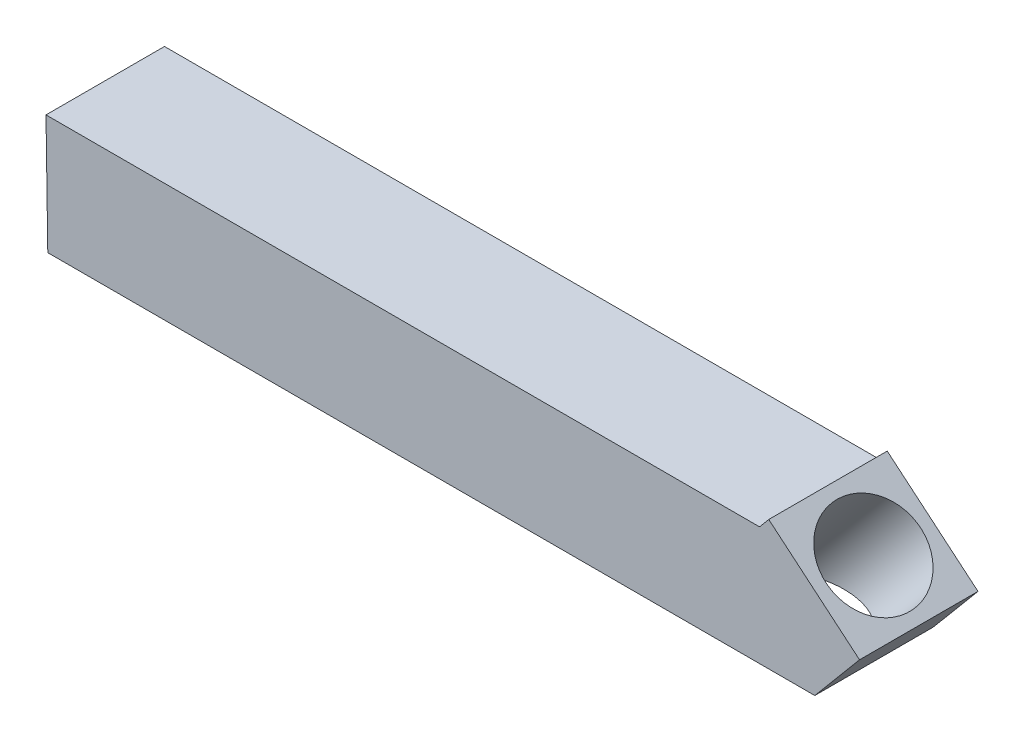
ISO-10303-21;
HEADER;
FILE_DESCRIPTION(('STEP AP214'),'2;1');
FILE_NAME('part.step','',(''),(''),'','','');
FILE_SCHEMA(('AUTOMOTIVE_DESIGN { 1 0 10303 214 1 1 1 1 }'));
ENDSEC;
DATA;
#1=APPLICATION_CONTEXT('core data for automotive mechanical design processes');
#2=APPLICATION_PROTOCOL_DEFINITION('international standard','automotive_design',2000,#1);
#3=PRODUCT_CONTEXT('',#1,'mechanical');
#4=PRODUCT('Part','Part','',(#3));
#5=PRODUCT_RELATED_PRODUCT_CATEGORY('part','',(#4));
#6=PRODUCT_DEFINITION_FORMATION('','',#4);
#7=PRODUCT_DEFINITION_CONTEXT('part definition',#1,'design');
#8=PRODUCT_DEFINITION('design','',#6,#7);
#9=PRODUCT_DEFINITION_SHAPE('','',#8);
#10=(LENGTH_UNIT() NAMED_UNIT(*) SI_UNIT(.MILLI.,.METRE.));
#11=(NAMED_UNIT(*) PLANE_ANGLE_UNIT() SI_UNIT($,.RADIAN.));
#12=(NAMED_UNIT(*) SI_UNIT($,.STERADIAN.) SOLID_ANGLE_UNIT());
#13=UNCERTAINTY_MEASURE_WITH_UNIT(LENGTH_MEASURE(1.E-05),#10,'distance_accuracy_value','');
#14=(GEOMETRIC_REPRESENTATION_CONTEXT(3) GLOBAL_UNCERTAINTY_ASSIGNED_CONTEXT((#13)) GLOBAL_UNIT_ASSIGNED_CONTEXT((#10,
#11,#12)) REPRESENTATION_CONTEXT('',''));
#15=CARTESIAN_POINT('',(0.,0.,0.));
#16=DIRECTION('',(0.,0.,1.));
#17=DIRECTION('',(1.,0.,0.));
#18=AXIS2_PLACEMENT_3D('',#15,#16,#17);
#19=CARTESIAN_POINT('',(-70.4061726678737,-77.7100601328562,2.5));
#20=DIRECTION('',(0.999885535757896,0.0151299498394764,0.));
#21=DIRECTION('',(-0.0151299498394764,0.999885535757896,0.));
#22=AXIS2_PLACEMENT_3D('',#19,#20,#21);
#23=PLANE('',#22);
#24=DIRECTION('',(0.0151299498394764,-0.999885535757896,0.));
#25=VECTOR('',#24,1.);
#26=CARTESIAN_POINT('',(-70.4061726678737,-77.7100601328562,0.));
#27=LINE('',#26,#25);
#28=CARTESIAN_POINT('',(-70.4061726678737,-77.7100601328562,0.));
#29=VERTEX_POINT('',#28);
#30=CARTESIAN_POINT('',(-70.368347793275,-80.209773972251,0.));
#31=VERTEX_POINT('',#30);
#32=EDGE_CURVE('E117',#29,#31,#27,.T.);
#33=ORIENTED_EDGE('',*,*,#32,.T.);
#34=DIRECTION('',(0.,0.,-1.));
#35=VECTOR('',#34,1.);
#36=CARTESIAN_POINT('',(-70.368347793275,-80.209773972251,2.5));
#37=LINE('',#36,#35);
#38=CARTESIAN_POINT('',(-70.368347793275,-80.209773972251,2.5));
#39=VERTEX_POINT('',#38);
#40=EDGE_CURVE('E11',#39,#31,#37,.T.);
#41=ORIENTED_EDGE('',*,*,#40,.F.);
#42=DIRECTION('',(0.0151299498394764,-0.999885535757896,0.));
#43=VECTOR('',#42,1.);
#44=CARTESIAN_POINT('',(-70.4061726678737,-77.7100601328562,2.5));
#45=LINE('',#44,#43);
#46=CARTESIAN_POINT('',(-70.4061726678737,-77.7100601328562,2.5));
#47=VERTEX_POINT('',#46);
#48=EDGE_CURVE('E128',#47,#39,#45,.T.);
#49=ORIENTED_EDGE('',*,*,#48,.F.);
#50=DIRECTION('',(0.,0.,-1.));
#51=VECTOR('',#50,1.);
#52=CARTESIAN_POINT('',(-70.4061726678737,-77.7100601328562,2.5));
#53=LINE('',#52,#51);
#54=EDGE_CURVE('E113',#47,#29,#53,.T.);
#55=ORIENTED_EDGE('',*,*,#54,.T.);
#56=EDGE_LOOP('',(#33,#41,#49,#55));
#57=FACE_BOUND('',#56,.T.);
#58=ADVANCED_FACE('F33',(#57),#23,.F.);
#59=CARTESIAN_POINT('',(-70.368347793275,-80.209773972251,2.5));
#60=DIRECTION('',(0.,1.,0.));
#61=DIRECTION('',(0.,0.,1.));
#62=AXIS2_PLACEMENT_3D('',#59,#60,#61);
#63=PLANE('',#62);
#64=CARTESIAN_POINT('',(-55.8162464207639,-80.209773972251,1.25));
#65=DIRECTION('',(0.,1.,0.));
#66=DIRECTION('',(1.,0.,0.));
#67=AXIS2_PLACEMENT_3D('',#64,#65,#66);
#68=ELLIPSE('',#67,1.3054072893277,0.999999999996499);
#69=CARTESIAN_POINT('',(-54.5108391314362,-80.209773972251,1.25));
#70=VERTEX_POINT('',#69);
#71=EDGE_CURVE('E121',#70,#70,#68,.T.);
#72=ORIENTED_EDGE('',*,*,#71,.T.);
#73=EDGE_LOOP('',(#72));
#74=FACE_BOUND('',#73,.T.);
#75=DIRECTION('',(1.,0.,0.));
#76=VECTOR('',#75,1.);
#77=CARTESIAN_POINT('',(-70.368347793275,-80.209773972251,0.));
#78=LINE('',#77,#76);
#79=CARTESIAN_POINT('',(-54.1844873090986,-80.209773972251,0.));
#80=VERTEX_POINT('',#79);
#81=EDGE_CURVE('E120',#31,#80,#78,.T.);
#82=ORIENTED_EDGE('',*,*,#81,.T.);
#83=DIRECTION('',(0.,0.,-1.));
#84=VECTOR('',#83,1.);
#85=CARTESIAN_POINT('',(-54.1844873090986,-80.209773972251,2.5));
#86=LINE('',#85,#84);
#87=CARTESIAN_POINT('',(-54.1844873090986,-80.209773972251,2.5));
#88=VERTEX_POINT('',#87);
#89=EDGE_CURVE('E41',#88,#80,#86,.T.);
#90=ORIENTED_EDGE('',*,*,#89,.F.);
#91=DIRECTION('',(1.,0.,0.));
#92=VECTOR('',#91,1.);
#93=CARTESIAN_POINT('',(-70.368347793275,-80.209773972251,2.5));
#94=LINE('',#93,#92);
#95=EDGE_CURVE('E86',#39,#88,#94,.T.);
#96=ORIENTED_EDGE('',*,*,#95,.F.);
#97=ORIENTED_EDGE('',*,*,#40,.T.);
#98=EDGE_LOOP('',(#82,#90,#96,#97));
#99=FACE_BOUND('',#98,.T.);
#100=ADVANCED_FACE('F152',(#74,#99),#63,.F.);
#101=CARTESIAN_POINT('',(-54.1844873090986,-80.209773972251,2.5));
#102=DIRECTION('',(-0.766044443118981,0.642787609686536,0.));
#103=DIRECTION('',(-0.642787609686536,-0.766044443118981,0.));
#104=AXIS2_PLACEMENT_3D('',#101,#102,#103);
#105=PLANE('',#104);
#106=DIRECTION('',(0.642787609686536,0.766044443118981,0.));
#107=VECTOR('',#106,1.);
#108=CARTESIAN_POINT('',(-54.1844873090986,-80.209773972251,0.));
#109=LINE('',#108,#107);
#110=CARTESIAN_POINT('',(-53.2406469454359,-79.0849488280205,0.));
#111=VERTEX_POINT('',#110);
#112=EDGE_CURVE('E123',#80,#111,#109,.T.);
#113=ORIENTED_EDGE('',*,*,#112,.T.);
#114=DIRECTION('',(0.,0.,-1.));
#115=VECTOR('',#114,1.);
#116=CARTESIAN_POINT('',(-53.2406469454359,-79.0849488280205,2.5));
#117=LINE('',#116,#115);
#118=CARTESIAN_POINT('',(-53.2406469454359,-79.0849488280205,2.5));
#119=VERTEX_POINT('',#118);
#120=EDGE_CURVE('E108',#119,#111,#117,.T.);
#121=ORIENTED_EDGE('',*,*,#120,.F.);
#122=DIRECTION('',(0.642787609686536,0.766044443118981,0.));
#123=VECTOR('',#122,1.);
#124=CARTESIAN_POINT('',(-54.1844873090986,-80.209773972251,2.5));
#125=LINE('',#124,#123);
#126=EDGE_CURVE('E99',#88,#119,#125,.T.);
#127=ORIENTED_EDGE('',*,*,#126,.F.);
#128=ORIENTED_EDGE('',*,*,#89,.T.);
#129=EDGE_LOOP('',(#113,#121,#127,#128));
#130=FACE_BOUND('',#129,.T.);
#131=ADVANCED_FACE('F134',(#130),#105,.F.);
#132=CARTESIAN_POINT('',(-53.2406469454359,-79.0849488280205,2.5));
#133=DIRECTION('',(-0.642787609686535,-0.766044443118982,0.));
#134=DIRECTION('',(0.766044443118982,-0.642787609686535,0.));
#135=AXIS2_PLACEMENT_3D('',#132,#133,#134);
#136=PLANE('',#135);
#137=CARTESIAN_POINT('',(-54.1982024993346,-78.2814643159123,1.25));
#138=DIRECTION('',(0.642787609686535,0.766044443118981,0.));
#139=DIRECTION('',(-0.766044443118981,0.642787609686535,0.));
#140=AXIS2_PLACEMENT_3D('',#137,#138,#139);
#141=CIRCLE('',#140,0.999999999996499);
#142=CARTESIAN_POINT('',(-54.9642469424509,-77.6386767062281,1.25));
#143=VERTEX_POINT('',#142);
#144=EDGE_CURVE('E170',#143,#143,#141,.T.);
#145=ORIENTED_EDGE('',*,*,#144,.F.);
#146=EDGE_LOOP('',(#145));
#147=FACE_BOUND('',#146,.T.);
#148=DIRECTION('',(-0.766044443118982,0.642787609686535,0.));
#149=VECTOR('',#148,1.);
#150=CARTESIAN_POINT('',(-53.2406469454359,-79.0849488280205,0.));
#151=LINE('',#150,#149);
#152=CARTESIAN_POINT('',(-55.1557580532333,-77.4779798038041,0.));
#153=VERTEX_POINT('',#152);
#154=EDGE_CURVE('E107',#111,#153,#151,.T.);
#155=ORIENTED_EDGE('',*,*,#154,.T.);
#156=DIRECTION('',(0.,0.,-1.));
#157=VECTOR('',#156,1.);
#158=CARTESIAN_POINT('',(-55.1557580532333,-77.4779798038041,2.5));
#159=LINE('',#158,#157);
#160=CARTESIAN_POINT('',(-55.1557580532333,-77.4779798038041,2.5));
#161=VERTEX_POINT('',#160);
#162=EDGE_CURVE('E104',#161,#153,#159,.T.);
#163=ORIENTED_EDGE('',*,*,#162,.F.);
#164=DIRECTION('',(-0.766044443118982,0.642787609686535,0.));
#165=VECTOR('',#164,1.);
#166=CARTESIAN_POINT('',(-53.2406469454359,-79.0849488280205,2.5));
#167=LINE('',#166,#165);
#168=EDGE_CURVE('E93',#119,#161,#167,.T.);
#169=ORIENTED_EDGE('',*,*,#168,.F.);
#170=ORIENTED_EDGE('',*,*,#120,.T.);
#171=EDGE_LOOP('',(#155,#163,#169,#170));
#172=FACE_BOUND('',#171,.T.);
#173=ADVANCED_FACE('F105',(#147,#172),#136,.F.);
#174=CARTESIAN_POINT('',(-55.3504965717444,-77.7100601328562,2.5));
#175=DIRECTION('',(0.766044443118984,-0.642787609686532,0.));
#176=DIRECTION('',(0.642787609686532,0.766044443118984,0.));
#177=AXIS2_PLACEMENT_3D('',#174,#175,#176);
#178=PLANE('',#177);
#179=DIRECTION('',(-0.642787609686532,-0.766044443118984,0.));
#180=VECTOR('',#179,1.);
#181=CARTESIAN_POINT('',(-55.3504965717444,-77.7100601328562,0.));
#182=LINE('',#181,#180);
#183=CARTESIAN_POINT('',(-55.3504965717444,-77.7100601328562,0.));
#184=VERTEX_POINT('',#183);
#185=EDGE_CURVE('E72',#153,#184,#182,.T.);
#186=ORIENTED_EDGE('',*,*,#185,.T.);
#187=DIRECTION('',(0.,0.,-1.));
#188=VECTOR('',#187,1.);
#189=CARTESIAN_POINT('',(-55.3504965717444,-77.7100601328562,2.5));
#190=LINE('',#189,#188);
#191=CARTESIAN_POINT('',(-55.3504965717444,-77.7100601328562,2.5));
#192=VERTEX_POINT('',#191);
#193=EDGE_CURVE('E109',#192,#184,#190,.T.);
#194=ORIENTED_EDGE('',*,*,#193,.F.);
#195=DIRECTION('',(-0.642787609686532,-0.766044443118984,0.));
#196=VECTOR('',#195,1.);
#197=CARTESIAN_POINT('',(-55.3504965717444,-77.7100601328562,2.5));
#198=LINE('',#197,#196);
#199=EDGE_CURVE('E97',#161,#192,#198,.T.);
#200=ORIENTED_EDGE('',*,*,#199,.F.);
#201=ORIENTED_EDGE('',*,*,#162,.T.);
#202=EDGE_LOOP('',(#186,#194,#200,#201));
#203=FACE_BOUND('',#202,.T.);
#204=ADVANCED_FACE('F111',(#203),#178,.F.);
#205=CARTESIAN_POINT('',(-70.4061726678737,-77.7100601328562,2.5));
#206=DIRECTION('',(0.,-1.,0.));
#207=DIRECTION('',(0.,0.,-1.));
#208=AXIS2_PLACEMENT_3D('',#205,#206,#207);
#209=PLANE('',#208);
#210=DIRECTION('',(-1.,0.,0.));
#211=VECTOR('',#210,1.);
#212=CARTESIAN_POINT('',(-70.4061726678737,-77.7100601328562,0.));
#213=LINE('',#212,#211);
#214=EDGE_CURVE('E78',#184,#29,#213,.T.);
#215=ORIENTED_EDGE('',*,*,#214,.T.);
#216=ORIENTED_EDGE('',*,*,#54,.F.);
#217=DIRECTION('',(-1.,0.,0.));
#218=VECTOR('',#217,1.);
#219=CARTESIAN_POINT('',(-70.4061726678737,-77.7100601328562,2.5));
#220=LINE('',#219,#218);
#221=EDGE_CURVE('E49',#192,#47,#220,.T.);
#222=ORIENTED_EDGE('',*,*,#221,.F.);
#223=ORIENTED_EDGE('',*,*,#193,.T.);
#224=EDGE_LOOP('',(#215,#216,#222,#223));
#225=FACE_BOUND('',#224,.T.);
#226=ADVANCED_FACE('F141',(#225),#209,.F.);
#227=CARTESIAN_POINT('',(0.,0.,2.5));
#228=DIRECTION('',(0.,0.,1.));
#229=DIRECTION('',(1.,0.,0.));
#230=AXIS2_PLACEMENT_3D('',#227,#228,#229);
#231=PLANE('',#230);
#232=ORIENTED_EDGE('',*,*,#48,.T.);
#233=ORIENTED_EDGE('',*,*,#95,.T.);
#234=ORIENTED_EDGE('',*,*,#126,.T.);
#235=ORIENTED_EDGE('',*,*,#168,.T.);
#236=ORIENTED_EDGE('',*,*,#199,.T.);
#237=ORIENTED_EDGE('',*,*,#221,.T.);
#238=EDGE_LOOP('',(#232,#233,#234,#235,#236,#237));
#239=FACE_BOUND('',#238,.T.);
#240=ADVANCED_FACE('F95',(#239),#231,.T.);
#241=CARTESIAN_POINT('',(0.,0.,0.));
#242=DIRECTION('',(0.,0.,1.));
#243=DIRECTION('',(1.,0.,0.));
#244=AXIS2_PLACEMENT_3D('',#241,#242,#243);
#245=PLANE('',#244);
#246=ORIENTED_EDGE('',*,*,#32,.F.);
#247=ORIENTED_EDGE('',*,*,#214,.F.);
#248=ORIENTED_EDGE('',*,*,#185,.F.);
#249=ORIENTED_EDGE('',*,*,#154,.F.);
#250=ORIENTED_EDGE('',*,*,#112,.F.);
#251=ORIENTED_EDGE('',*,*,#81,.F.);
#252=EDGE_LOOP('',(#246,#247,#248,#249,#250,#251));
#253=FACE_BOUND('',#252,.T.);
#254=ADVANCED_FACE('F137',(#253),#245,.F.);
#255=CARTESIAN_POINT('',(-57.090746742924,-81.7286643099478,1.25));
#256=DIRECTION('',(0.642787609686535,0.766044443118981,0.));
#257=DIRECTION('',(-0.766044443118982,0.642787609686535,0.));
#258=AXIS2_PLACEMENT_3D('',#255,#256,#257);
#259=CYLINDRICAL_SURFACE('',#258,0.999999999996499);
#260=ORIENTED_EDGE('',*,*,#144,.T.);
#261=EDGE_LOOP('',(#260));
#262=FACE_BOUND('',#261,.T.);
#263=ORIENTED_EDGE('',*,*,#71,.F.);
#264=EDGE_LOOP('',(#263));
#265=FACE_BOUND('',#264,.T.);
#266=ADVANCED_FACE('F178',(#262,#265),#259,.F.);
#267=CLOSED_SHELL('',(#58,#100,#131,#173,#204,#226,#240,#254,#266));
#268=MANIFOLD_SOLID_BREP('B2',#267);
#269=ADVANCED_BREP_SHAPE_REPRESENTATION('',(#18,#268),#14);
#270=SHAPE_DEFINITION_REPRESENTATION(#9,#269);
ENDSEC;
END-ISO-10303-21;
